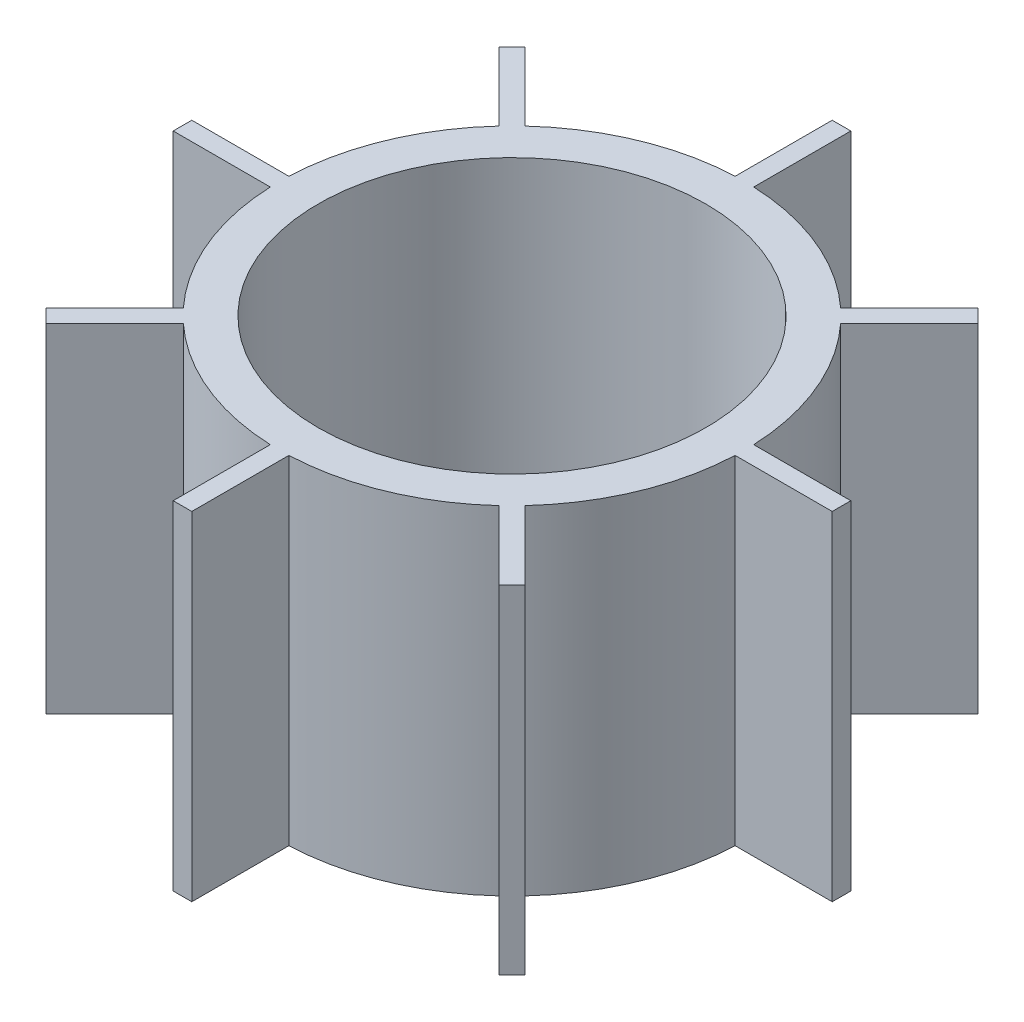
ISO-10303-21;
HEADER;
FILE_DESCRIPTION(('STEP AP214'),'2;1');
FILE_NAME('part.step','',(''),(''),'','','');
FILE_SCHEMA(('AUTOMOTIVE_DESIGN { 1 0 10303 214 1 1 1 1 }'));
ENDSEC;
DATA;
#1=APPLICATION_CONTEXT('core data for automotive mechanical design processes');
#2=APPLICATION_PROTOCOL_DEFINITION('international standard','automotive_design',2000,#1);
#3=PRODUCT_CONTEXT('',#1,'mechanical');
#4=PRODUCT('Part','Part','',(#3));
#5=PRODUCT_RELATED_PRODUCT_CATEGORY('part','',(#4));
#6=PRODUCT_DEFINITION_FORMATION('','',#4);
#7=PRODUCT_DEFINITION_CONTEXT('part definition',#1,'design');
#8=PRODUCT_DEFINITION('design','',#6,#7);
#9=PRODUCT_DEFINITION_SHAPE('','',#8);
#10=(LENGTH_UNIT() NAMED_UNIT(*) SI_UNIT(.MILLI.,.METRE.));
#11=(NAMED_UNIT(*) PLANE_ANGLE_UNIT() SI_UNIT($,.RADIAN.));
#12=(NAMED_UNIT(*) SI_UNIT($,.STERADIAN.) SOLID_ANGLE_UNIT());
#13=UNCERTAINTY_MEASURE_WITH_UNIT(LENGTH_MEASURE(1.E-05),#10,'distance_accuracy_value','');
#14=(GEOMETRIC_REPRESENTATION_CONTEXT(3) GLOBAL_UNCERTAINTY_ASSIGNED_CONTEXT((#13)) GLOBAL_UNIT_ASSIGNED_CONTEXT((#10,
#11,#12)) REPRESENTATION_CONTEXT('',''));
#15=CARTESIAN_POINT('',(0.,0.,0.));
#16=DIRECTION('',(0.,0.,1.));
#17=DIRECTION('',(1.,0.,0.));
#18=AXIS2_PLACEMENT_3D('',#15,#16,#17);
#19=CARTESIAN_POINT('',(0.,55.372,0.));
#20=DIRECTION('',(0.,-1.,0.));
#21=DIRECTION('',(0.,0.,-1.));
#22=AXIS2_PLACEMENT_3D('',#19,#20,#21);
#23=CYLINDRICAL_SURFACE('',#22,38.1);
#24=CARTESIAN_POINT('',(0.,55.372,0.));
#25=DIRECTION('',(0.,1.,0.));
#26=DIRECTION('',(0.,0.,1.));
#27=AXIS2_PLACEMENT_3D('',#24,#25,#26);
#28=CIRCLE('',#27,38.1);
#29=CARTESIAN_POINT('',(-25.8415763860386,55.372,27.9968378550959));
#30=VERTEX_POINT('',#29);
#31=CARTESIAN_POINT('',(-1.524,55.372,38.0695077982366));
#32=VERTEX_POINT('',#31);
#33=EDGE_CURVE('E287',#30,#32,#28,.T.);
#34=ORIENTED_EDGE('',*,*,#33,.F.);
#35=DIRECTION('',(0.,-1.,0.));
#36=VECTOR('',#35,1.);
#37=CARTESIAN_POINT('',(-25.8415763860386,55.372,27.9968378550959));
#38=LINE('',#37,#36);
#39=CARTESIAN_POINT('',(-25.8415763860386,0.,27.9968378550959));
#40=VERTEX_POINT('',#39);
#41=EDGE_CURVE('E464',#40,#30,#38,.F.);
#42=ORIENTED_EDGE('',*,*,#41,.F.);
#43=CARTESIAN_POINT('',(0.,0.,0.));
#44=DIRECTION('',(0.,1.,0.));
#45=DIRECTION('',(0.,0.,1.));
#46=AXIS2_PLACEMENT_3D('',#43,#44,#45);
#47=CIRCLE('',#46,38.1);
#48=CARTESIAN_POINT('',(-1.524,0.,38.0695077982366));
#49=VERTEX_POINT('',#48);
#50=EDGE_CURVE('E255',#40,#49,#47,.T.);
#51=ORIENTED_EDGE('',*,*,#50,.T.);
#52=DIRECTION('',(0.,-1.,0.));
#53=VECTOR('',#52,1.);
#54=CARTESIAN_POINT('',(-1.524,55.372,38.0695077982366));
#55=LINE('',#54,#53);
#56=EDGE_CURVE('E262',#32,#49,#55,.T.);
#57=ORIENTED_EDGE('',*,*,#56,.F.);
#58=EDGE_LOOP('',(#34,#42,#51,#57));
#59=FACE_BOUND('',#58,.T.);
#60=ADVANCED_FACE('F30',(#59),#23,.T.);
#61=CARTESIAN_POINT('',(-37.0884577800151,0.,39.2437192490727));
#62=DIRECTION('',(-0.707106781186539,0.,0.707106781186556));
#63=DIRECTION('',(0.707106781186556,0.,0.707106781186539));
#64=AXIS2_PLACEMENT_3D('',#61,#62,#63);
#65=PLANE('',#64);
#66=DIRECTION('',(0.,1.,0.));
#67=VECTOR('',#66,1.);
#68=CARTESIAN_POINT('',(-37.0884577800151,55.372,39.2437192490727));
#69=LINE('',#68,#67);
#70=CARTESIAN_POINT('',(-37.0884577800151,0.,39.2437192490727));
#71=VERTEX_POINT('',#70);
#72=CARTESIAN_POINT('',(-37.0884577800151,55.372,39.2437192490727));
#73=VERTEX_POINT('',#72);
#74=EDGE_CURVE('E467',#71,#73,#69,.T.);
#75=ORIENTED_EDGE('',*,*,#74,.T.);
#76=DIRECTION('',(-0.707106781186556,0.,-0.707106781186539));
#77=VECTOR('',#76,1.);
#78=CARTESIAN_POINT('',(-39.2437192490717,55.372,37.0884577800161));
#79=LINE('',#78,#77);
#80=CARTESIAN_POINT('',(-39.2437192490717,55.372,37.0884577800161));
#81=VERTEX_POINT('',#80);
#82=EDGE_CURVE('E38',#73,#81,#79,.T.);
#83=ORIENTED_EDGE('',*,*,#82,.T.);
#84=DIRECTION('',(0.,-1.,0.));
#85=VECTOR('',#84,1.);
#86=CARTESIAN_POINT('',(-39.2437192490717,55.372,37.0884577800161));
#87=LINE('',#86,#85);
#88=CARTESIAN_POINT('',(-39.2437192490717,0.,37.0884577800161));
#89=VERTEX_POINT('',#88);
#90=EDGE_CURVE('E460',#81,#89,#87,.T.);
#91=ORIENTED_EDGE('',*,*,#90,.T.);
#92=DIRECTION('',(0.707106781186556,0.,0.707106781186539));
#93=VECTOR('',#92,1.);
#94=CARTESIAN_POINT('',(-39.2437192490717,0.,37.0884577800161));
#95=LINE('',#94,#93);
#96=EDGE_CURVE('E11',#89,#71,#95,.T.);
#97=ORIENTED_EDGE('',*,*,#96,.T.);
#98=EDGE_LOOP('',(#75,#83,#91,#97));
#99=FACE_BOUND('',#98,.T.);
#100=ADVANCED_FACE('F32',(#99),#65,.T.);
#101=CARTESIAN_POINT('',(353554.468224004,55.372,-353552.312962544));
#102=DIRECTION('',(0.707106781186556,0.,0.707106781186539));
#103=DIRECTION('',(0.707106781186539,0.,-0.707106781186556));
#104=AXIS2_PLACEMENT_3D('',#101,#102,#103);
#105=PLANE('',#104);
#106=DIRECTION('',(-0.707106781186539,0.,0.707106781186556));
#107=VECTOR('',#106,1.);
#108=CARTESIAN_POINT('',(353554.468224004,0.,-353552.312962544));
#109=LINE('',#108,#107);
#110=EDGE_CURVE('E45',#40,#71,#109,.T.);
#111=ORIENTED_EDGE('',*,*,#110,.F.);
#112=ORIENTED_EDGE('',*,*,#41,.T.);
#113=DIRECTION('',(-0.707106781186539,0.,0.707106781186556));
#114=VECTOR('',#113,1.);
#115=CARTESIAN_POINT('',(353554.468224004,55.372,-353552.312962544));
#116=LINE('',#115,#114);
#117=EDGE_CURVE('E52',#30,#73,#116,.T.);
#118=ORIENTED_EDGE('',*,*,#117,.T.);
#119=ORIENTED_EDGE('',*,*,#74,.F.);
#120=EDGE_LOOP('',(#111,#112,#118,#119));
#121=FACE_BOUND('',#120,.T.);
#122=ADVANCED_FACE('F615',(#121),#105,.T.);
#123=CARTESIAN_POINT('',(353552.312962535,55.372,-353554.468224013));
#124=DIRECTION('',(-0.707106781186556,0.,-0.707106781186539));
#125=DIRECTION('',(-0.707106781186539,0.,0.707106781186556));
#126=AXIS2_PLACEMENT_3D('',#123,#124,#125);
#127=PLANE('',#126);
#128=DIRECTION('',(-0.707106781186539,0.,0.707106781186556));
#129=VECTOR('',#128,1.);
#130=CARTESIAN_POINT('',(353552.312962535,55.372,-353554.468224013));
#131=LINE('',#130,#129);
#132=CARTESIAN_POINT('',(-27.9968378550953,55.372,25.8415763860393));
#133=VERTEX_POINT('',#132);
#134=EDGE_CURVE('E453',#133,#81,#131,.T.);
#135=ORIENTED_EDGE('',*,*,#134,.F.);
#136=DIRECTION('',(0.,-1.,0.));
#137=VECTOR('',#136,1.);
#138=CARTESIAN_POINT('',(-27.9968378550953,55.372,25.8415763860393));
#139=LINE('',#138,#137);
#140=CARTESIAN_POINT('',(-27.9968378550953,0.,25.8415763860393));
#141=VERTEX_POINT('',#140);
#142=EDGE_CURVE('E455',#133,#141,#139,.T.);
#143=ORIENTED_EDGE('',*,*,#142,.T.);
#144=DIRECTION('',(-0.707106781186539,0.,0.707106781186556));
#145=VECTOR('',#144,1.);
#146=CARTESIAN_POINT('',(353552.312962535,0.,-353554.468224013));
#147=LINE('',#146,#145);
#148=EDGE_CURVE('E458',#141,#89,#147,.T.);
#149=ORIENTED_EDGE('',*,*,#148,.T.);
#150=ORIENTED_EDGE('',*,*,#90,.F.);
#151=EDGE_LOOP('',(#135,#143,#149,#150));
#152=FACE_BOUND('',#151,.T.);
#153=ADVANCED_FACE('F479',(#152),#127,.T.);
#154=CARTESIAN_POINT('',(-38.0695077982366,55.372,1.5240000000004));
#155=VERTEX_POINT('',#154);
#156=EDGE_CURVE('E425',#155,#133,#28,.T.);
#157=ORIENTED_EDGE('',*,*,#156,.F.);
#158=DIRECTION('',(0.,-1.,0.));
#159=VECTOR('',#158,1.);
#160=CARTESIAN_POINT('',(-38.0695077982366,55.372,1.5240000000004));
#161=LINE('',#160,#159);
#162=CARTESIAN_POINT('',(-38.0695077982366,0.,1.5240000000004));
#163=VERTEX_POINT('',#162);
#164=EDGE_CURVE('E439',#163,#155,#161,.F.);
#165=ORIENTED_EDGE('',*,*,#164,.F.);
#166=EDGE_CURVE('E429',#163,#141,#47,.T.);
#167=ORIENTED_EDGE('',*,*,#166,.T.);
#168=ORIENTED_EDGE('',*,*,#142,.F.);
#169=EDGE_LOOP('',(#157,#165,#167,#168));
#170=FACE_BOUND('',#169,.T.);
#171=ADVANCED_FACE('F488',(#170),#23,.T.);
#172=CARTESIAN_POINT('',(-53.975,0.,1.52400000000057));
#173=DIRECTION('',(-1.,0.,0.));
#174=DIRECTION('',(0.,0.,1.));
#175=AXIS2_PLACEMENT_3D('',#172,#173,#174);
#176=PLANE('',#175);
#177=DIRECTION('',(0.,1.,0.));
#178=VECTOR('',#177,1.);
#179=CARTESIAN_POINT('',(-53.975,55.372,1.52400000000057));
#180=LINE('',#179,#178);
#181=CARTESIAN_POINT('',(-53.975,0.,1.52400000000057));
#182=VERTEX_POINT('',#181);
#183=CARTESIAN_POINT('',(-53.975,55.372,1.52400000000057));
#184=VERTEX_POINT('',#183);
#185=EDGE_CURVE('E444',#182,#184,#180,.T.);
#186=ORIENTED_EDGE('',*,*,#185,.T.);
#187=DIRECTION('',(0.,0.,-1.));
#188=VECTOR('',#187,1.);
#189=CARTESIAN_POINT('',(-53.975,55.372,-1.52399999999943));
#190=LINE('',#189,#188);
#191=CARTESIAN_POINT('',(-53.975,55.372,-1.52399999999943));
#192=VERTEX_POINT('',#191);
#193=EDGE_CURVE('E447',#184,#192,#190,.T.);
#194=ORIENTED_EDGE('',*,*,#193,.T.);
#195=DIRECTION('',(0.,-1.,0.));
#196=VECTOR('',#195,1.);
#197=CARTESIAN_POINT('',(-53.975,55.372,-1.52399999999943));
#198=LINE('',#197,#196);
#199=CARTESIAN_POINT('',(-53.975,0.,-1.52399999999943));
#200=VERTEX_POINT('',#199);
#201=EDGE_CURVE('E434',#192,#200,#198,.T.);
#202=ORIENTED_EDGE('',*,*,#201,.T.);
#203=DIRECTION('',(0.,0.,1.));
#204=VECTOR('',#203,1.);
#205=CARTESIAN_POINT('',(-53.975,0.,-1.52399999999943));
#206=LINE('',#205,#204);
#207=EDGE_CURVE('E450',#200,#182,#206,.T.);
#208=ORIENTED_EDGE('',*,*,#207,.T.);
#209=EDGE_LOOP('',(#186,#194,#202,#208));
#210=FACE_BOUND('',#209,.T.);
#211=ADVANCED_FACE('F543',(#210),#176,.T.);
#212=CARTESIAN_POINT('',(500000.,55.372,1.52399999476278));
#213=DIRECTION('',(0.,0.,1.));
#214=DIRECTION('',(1.,0.,0.));
#215=AXIS2_PLACEMENT_3D('',#212,#213,#214);
#216=PLANE('',#215);
#217=DIRECTION('',(-1.,0.,0.));
#218=VECTOR('',#217,1.);
#219=CARTESIAN_POINT('',(500000.,0.,1.52399999476278));
#220=LINE('',#219,#218);
#221=EDGE_CURVE('E437',#163,#182,#220,.T.);
#222=ORIENTED_EDGE('',*,*,#221,.F.);
#223=ORIENTED_EDGE('',*,*,#164,.T.);
#224=DIRECTION('',(-1.,0.,0.));
#225=VECTOR('',#224,1.);
#226=CARTESIAN_POINT('',(500000.,55.372,1.52399999476278));
#227=LINE('',#226,#225);
#228=EDGE_CURVE('E442',#155,#184,#227,.T.);
#229=ORIENTED_EDGE('',*,*,#228,.T.);
#230=ORIENTED_EDGE('',*,*,#185,.F.);
#231=EDGE_LOOP('',(#222,#223,#229,#230));
#232=FACE_BOUND('',#231,.T.);
#233=ADVANCED_FACE('F487',(#232),#216,.T.);
#234=CARTESIAN_POINT('',(500000.,55.372,-1.52400000523722));
#235=DIRECTION('',(0.,0.,-1.));
#236=DIRECTION('',(-1.,0.,0.));
#237=AXIS2_PLACEMENT_3D('',#234,#235,#236);
#238=PLANE('',#237);
#239=DIRECTION('',(-1.,0.,0.));
#240=VECTOR('',#239,1.);
#241=CARTESIAN_POINT('',(500000.,55.372,-1.52400000523722));
#242=LINE('',#241,#240);
#243=CARTESIAN_POINT('',(-38.0695077982366,55.372,-1.5239999999996));
#244=VERTEX_POINT('',#243);
#245=EDGE_CURVE('E426',#244,#192,#242,.T.);
#246=ORIENTED_EDGE('',*,*,#245,.F.);
#247=DIRECTION('',(0.,-1.,0.));
#248=VECTOR('',#247,1.);
#249=CARTESIAN_POINT('',(-38.0695077982366,55.372,-1.5239999999996));
#250=LINE('',#249,#248);
#251=CARTESIAN_POINT('',(-38.0695077982366,0.,-1.5239999999996));
#252=VERTEX_POINT('',#251);
#253=EDGE_CURVE('E428',#244,#252,#250,.T.);
#254=ORIENTED_EDGE('',*,*,#253,.T.);
#255=DIRECTION('',(-1.,0.,0.));
#256=VECTOR('',#255,1.);
#257=CARTESIAN_POINT('',(500000.,0.,-1.52400000523722));
#258=LINE('',#257,#256);
#259=EDGE_CURVE('E432',#252,#200,#258,.T.);
#260=ORIENTED_EDGE('',*,*,#259,.T.);
#261=ORIENTED_EDGE('',*,*,#201,.F.);
#262=EDGE_LOOP('',(#246,#254,#260,#261));
#263=FACE_BOUND('',#262,.T.);
#264=ADVANCED_FACE('F540',(#263),#238,.T.);
#265=CARTESIAN_POINT('',(-27.9968378550958,55.372,-25.8415763860387));
#266=VERTEX_POINT('',#265);
#267=EDGE_CURVE('E397',#266,#244,#28,.T.);
#268=ORIENTED_EDGE('',*,*,#267,.F.);
#269=DIRECTION('',(0.,-1.,0.));
#270=VECTOR('',#269,1.);
#271=CARTESIAN_POINT('',(-27.9968378550958,55.372,-25.8415763860387));
#272=LINE('',#271,#270);
#273=CARTESIAN_POINT('',(-27.9968378550958,0.,-25.8415763860387));
#274=VERTEX_POINT('',#273);
#275=EDGE_CURVE('E411',#274,#266,#272,.F.);
#276=ORIENTED_EDGE('',*,*,#275,.F.);
#277=EDGE_CURVE('E401',#274,#252,#47,.T.);
#278=ORIENTED_EDGE('',*,*,#277,.T.);
#279=ORIENTED_EDGE('',*,*,#253,.F.);
#280=EDGE_LOOP('',(#268,#276,#278,#279));
#281=FACE_BOUND('',#280,.T.);
#282=ADVANCED_FACE('F535',(#281),#23,.T.);
#283=CARTESIAN_POINT('',(-39.2437192490725,0.,-37.0884577800153));
#284=DIRECTION('',(-0.707106781186554,0.,-0.707106781186541));
#285=DIRECTION('',(-0.707106781186541,0.,0.707106781186554));
#286=AXIS2_PLACEMENT_3D('',#283,#284,#285);
#287=PLANE('',#286);
#288=DIRECTION('',(0.,1.,0.));
#289=VECTOR('',#288,1.);
#290=CARTESIAN_POINT('',(-39.2437192490725,55.372,-37.0884577800153));
#291=LINE('',#290,#289);
#292=CARTESIAN_POINT('',(-39.2437192490725,0.,-37.0884577800153));
#293=VERTEX_POINT('',#292);
#294=CARTESIAN_POINT('',(-39.2437192490725,55.372,-37.0884577800153));
#295=VERTEX_POINT('',#294);
#296=EDGE_CURVE('E416',#293,#295,#291,.T.);
#297=ORIENTED_EDGE('',*,*,#296,.T.);
#298=DIRECTION('',(0.707106781186541,0.,-0.707106781186554));
#299=VECTOR('',#298,1.);
#300=CARTESIAN_POINT('',(-37.0884577800159,55.372,-39.2437192490719));
#301=LINE('',#300,#299);
#302=CARTESIAN_POINT('',(-37.0884577800159,55.372,-39.2437192490719));
#303=VERTEX_POINT('',#302);
#304=EDGE_CURVE('E419',#295,#303,#301,.T.);
#305=ORIENTED_EDGE('',*,*,#304,.T.);
#306=DIRECTION('',(0.,-1.,0.));
#307=VECTOR('',#306,1.);
#308=CARTESIAN_POINT('',(-37.0884577800159,55.372,-39.2437192490719));
#309=LINE('',#308,#307);
#310=CARTESIAN_POINT('',(-37.0884577800159,0.,-39.2437192490719));
#311=VERTEX_POINT('',#310);
#312=EDGE_CURVE('E406',#303,#311,#309,.T.);
#313=ORIENTED_EDGE('',*,*,#312,.T.);
#314=DIRECTION('',(-0.707106781186541,0.,0.707106781186554));
#315=VECTOR('',#314,1.);
#316=CARTESIAN_POINT('',(-37.0884577800159,0.,-39.2437192490719));
#317=LINE('',#316,#315);
#318=EDGE_CURVE('E422',#311,#293,#317,.T.);
#319=ORIENTED_EDGE('',*,*,#318,.T.);
#320=EDGE_LOOP('',(#297,#305,#313,#319));
#321=FACE_BOUND('',#320,.T.);
#322=ADVANCED_FACE('F553',(#321),#287,.T.);
#323=CARTESIAN_POINT('',(353552.312962542,55.372,353554.468224005));
#324=DIRECTION('',(-0.707106781186541,0.,0.707106781186554));
#325=DIRECTION('',(0.707106781186554,0.,0.707106781186541));
#326=AXIS2_PLACEMENT_3D('',#323,#324,#325);
#327=PLANE('',#326);
#328=DIRECTION('',(-0.707106781186554,0.,-0.707106781186541));
#329=VECTOR('',#328,1.);
#330=CARTESIAN_POINT('',(353552.312962542,0.,353554.468224005));
#331=LINE('',#330,#329);
#332=EDGE_CURVE('E409',#274,#293,#331,.T.);
#333=ORIENTED_EDGE('',*,*,#332,.F.);
#334=ORIENTED_EDGE('',*,*,#275,.T.);
#335=DIRECTION('',(-0.707106781186554,0.,-0.707106781186541));
#336=VECTOR('',#335,1.);
#337=CARTESIAN_POINT('',(353552.312962542,55.372,353554.468224005));
#338=LINE('',#337,#336);
#339=EDGE_CURVE('E414',#266,#295,#338,.T.);
#340=ORIENTED_EDGE('',*,*,#339,.T.);
#341=ORIENTED_EDGE('',*,*,#296,.F.);
#342=EDGE_LOOP('',(#333,#334,#340,#341));
#343=FACE_BOUND('',#342,.T.);
#344=ADVANCED_FACE('F548',(#343),#327,.T.);
#345=CARTESIAN_POINT('',(353554.468224011,55.372,353552.312962536));
#346=DIRECTION('',(0.707106781186541,0.,-0.707106781186554));
#347=DIRECTION('',(-0.707106781186554,0.,-0.707106781186541));
#348=AXIS2_PLACEMENT_3D('',#345,#346,#347);
#349=PLANE('',#348);
#350=DIRECTION('',(-0.707106781186554,0.,-0.707106781186541));
#351=VECTOR('',#350,1.);
#352=CARTESIAN_POINT('',(353554.468224011,55.372,353552.312962536));
#353=LINE('',#352,#351);
#354=CARTESIAN_POINT('',(-25.8415763860392,55.372,-27.9968378550954));
#355=VERTEX_POINT('',#354);
#356=EDGE_CURVE('E398',#355,#303,#353,.T.);
#357=ORIENTED_EDGE('',*,*,#356,.F.);
#358=DIRECTION('',(0.,-1.,0.));
#359=VECTOR('',#358,1.);
#360=CARTESIAN_POINT('',(-25.8415763860392,55.372,-27.9968378550954));
#361=LINE('',#360,#359);
#362=CARTESIAN_POINT('',(-25.8415763860392,0.,-27.9968378550954));
#363=VERTEX_POINT('',#362);
#364=EDGE_CURVE('E400',#355,#363,#361,.T.);
#365=ORIENTED_EDGE('',*,*,#364,.T.);
#366=DIRECTION('',(-0.707106781186554,0.,-0.707106781186541));
#367=VECTOR('',#366,1.);
#368=CARTESIAN_POINT('',(353554.468224011,0.,353552.312962536));
#369=LINE('',#368,#367);
#370=EDGE_CURVE('E404',#363,#311,#369,.T.);
#371=ORIENTED_EDGE('',*,*,#370,.T.);
#372=ORIENTED_EDGE('',*,*,#312,.F.);
#373=EDGE_LOOP('',(#357,#365,#371,#372));
#374=FACE_BOUND('',#373,.T.);
#375=ADVANCED_FACE('F556',(#374),#349,.T.);
#376=CARTESIAN_POINT('',(-1.524,55.372,-38.0695077982366));
#377=VERTEX_POINT('',#376);
#378=EDGE_CURVE('E369',#377,#355,#28,.T.);
#379=ORIENTED_EDGE('',*,*,#378,.F.);
#380=DIRECTION('',(0.,-1.,0.));
#381=VECTOR('',#380,1.);
#382=CARTESIAN_POINT('',(-1.524,55.372,-38.0695077982366));
#383=LINE('',#382,#381);
#384=CARTESIAN_POINT('',(-1.524,0.,-38.0695077982366));
#385=VERTEX_POINT('',#384);
#386=EDGE_CURVE('E383',#385,#377,#383,.F.);
#387=ORIENTED_EDGE('',*,*,#386,.F.);
#388=EDGE_CURVE('E373',#385,#363,#47,.T.);
#389=ORIENTED_EDGE('',*,*,#388,.T.);
#390=ORIENTED_EDGE('',*,*,#364,.F.);
#391=EDGE_LOOP('',(#379,#387,#389,#390));
#392=FACE_BOUND('',#391,.T.);
#393=ADVANCED_FACE('F557',(#392),#23,.T.);
#394=CARTESIAN_POINT('',(-1.524,0.,-53.975));
#395=DIRECTION('',(0.,0.,-1.));
#396=DIRECTION('',(-1.,0.,0.));
#397=AXIS2_PLACEMENT_3D('',#394,#395,#396);
#398=PLANE('',#397);
#399=DIRECTION('',(0.,1.,0.));
#400=VECTOR('',#399,1.);
#401=CARTESIAN_POINT('',(-1.524,55.372,-53.975));
#402=LINE('',#401,#400);
#403=CARTESIAN_POINT('',(-1.524,0.,-53.975));
#404=VERTEX_POINT('',#403);
#405=CARTESIAN_POINT('',(-1.524,55.372,-53.975));
#406=VERTEX_POINT('',#405);
#407=EDGE_CURVE('E388',#404,#406,#402,.T.);
#408=ORIENTED_EDGE('',*,*,#407,.T.);
#409=DIRECTION('',(1.,0.,0.));
#410=VECTOR('',#409,1.);
#411=CARTESIAN_POINT('',(1.524,55.372,-53.975));
#412=LINE('',#411,#410);
#413=CARTESIAN_POINT('',(1.524,55.372,-53.975));
#414=VERTEX_POINT('',#413);
#415=EDGE_CURVE('E391',#406,#414,#412,.T.);
#416=ORIENTED_EDGE('',*,*,#415,.T.);
#417=DIRECTION('',(0.,-1.,0.));
#418=VECTOR('',#417,1.);
#419=CARTESIAN_POINT('',(1.524,55.372,-53.975));
#420=LINE('',#419,#418);
#421=CARTESIAN_POINT('',(1.524,0.,-53.975));
#422=VERTEX_POINT('',#421);
#423=EDGE_CURVE('E378',#414,#422,#420,.T.);
#424=ORIENTED_EDGE('',*,*,#423,.T.);
#425=DIRECTION('',(-1.,0.,0.));
#426=VECTOR('',#425,1.);
#427=CARTESIAN_POINT('',(1.524,0.,-53.975));
#428=LINE('',#427,#426);
#429=EDGE_CURVE('E394',#422,#404,#428,.T.);
#430=ORIENTED_EDGE('',*,*,#429,.T.);
#431=EDGE_LOOP('',(#408,#416,#424,#430));
#432=FACE_BOUND('',#431,.T.);
#433=ADVANCED_FACE('F565',(#432),#398,.T.);
#434=CARTESIAN_POINT('',(-1.524,55.372,500000.));
#435=DIRECTION('',(-1.,0.,0.));
#436=DIRECTION('',(0.,0.,1.));
#437=AXIS2_PLACEMENT_3D('',#434,#435,#436);
#438=PLANE('',#437);
#439=DIRECTION('',(0.,0.,-1.));
#440=VECTOR('',#439,1.);
#441=CARTESIAN_POINT('',(-1.524,0.,500000.));
#442=LINE('',#441,#440);
#443=EDGE_CURVE('E381',#385,#404,#442,.T.);
#444=ORIENTED_EDGE('',*,*,#443,.F.);
#445=ORIENTED_EDGE('',*,*,#386,.T.);
#446=DIRECTION('',(0.,0.,-1.));
#447=VECTOR('',#446,1.);
#448=CARTESIAN_POINT('',(-1.524,55.372,500000.));
#449=LINE('',#448,#447);
#450=EDGE_CURVE('E386',#377,#406,#449,.T.);
#451=ORIENTED_EDGE('',*,*,#450,.T.);
#452=ORIENTED_EDGE('',*,*,#407,.F.);
#453=EDGE_LOOP('',(#444,#445,#451,#452));
#454=FACE_BOUND('',#453,.T.);
#455=ADVANCED_FACE('F560',(#454),#438,.T.);
#456=CARTESIAN_POINT('',(1.524,55.372,500000.));
#457=DIRECTION('',(1.,0.,0.));
#458=DIRECTION('',(0.,0.,-1.));
#459=AXIS2_PLACEMENT_3D('',#456,#457,#458);
#460=PLANE('',#459);
#461=DIRECTION('',(0.,0.,-1.));
#462=VECTOR('',#461,1.);
#463=CARTESIAN_POINT('',(1.524,55.372,500000.));
#464=LINE('',#463,#462);
#465=CARTESIAN_POINT('',(1.524,55.372,-38.0695077982366));
#466=VERTEX_POINT('',#465);
#467=EDGE_CURVE('E370',#466,#414,#464,.T.);
#468=ORIENTED_EDGE('',*,*,#467,.F.);
#469=DIRECTION('',(0.,-1.,0.));
#470=VECTOR('',#469,1.);
#471=CARTESIAN_POINT('',(1.524,55.372,-38.0695077982366));
#472=LINE('',#471,#470);
#473=CARTESIAN_POINT('',(1.524,0.,-38.0695077982366));
#474=VERTEX_POINT('',#473);
#475=EDGE_CURVE('E372',#466,#474,#472,.T.);
#476=ORIENTED_EDGE('',*,*,#475,.T.);
#477=DIRECTION('',(0.,0.,-1.));
#478=VECTOR('',#477,1.);
#479=CARTESIAN_POINT('',(1.524,0.,500000.));
#480=LINE('',#479,#478);
#481=EDGE_CURVE('E376',#474,#422,#480,.T.);
#482=ORIENTED_EDGE('',*,*,#481,.T.);
#483=ORIENTED_EDGE('',*,*,#423,.F.);
#484=EDGE_LOOP('',(#468,#476,#482,#483));
#485=FACE_BOUND('',#484,.T.);
#486=ADVANCED_FACE('F570',(#485),#460,.T.);
#487=CARTESIAN_POINT('',(25.8415763860388,55.372,-27.9968378550957));
#488=VERTEX_POINT('',#487);
#489=EDGE_CURVE('E341',#488,#466,#28,.T.);
#490=ORIENTED_EDGE('',*,*,#489,.F.);
#491=DIRECTION('',(0.,-1.,0.));
#492=VECTOR('',#491,1.);
#493=CARTESIAN_POINT('',(25.8415763860388,55.372,-27.9968378550957));
#494=LINE('',#493,#492);
#495=CARTESIAN_POINT('',(25.8415763860388,0.,-27.9968378550957));
#496=VERTEX_POINT('',#495);
#497=EDGE_CURVE('E355',#496,#488,#494,.F.);
#498=ORIENTED_EDGE('',*,*,#497,.F.);
#499=EDGE_CURVE('E345',#496,#474,#47,.T.);
#500=ORIENTED_EDGE('',*,*,#499,.T.);
#501=ORIENTED_EDGE('',*,*,#475,.F.);
#502=EDGE_LOOP('',(#490,#498,#500,#501));
#503=FACE_BOUND('',#502,.T.);
#504=ADVANCED_FACE('F573',(#503),#23,.T.);
#505=CARTESIAN_POINT('',(37.0884577800154,0.,-39.2437192490724));
#506=DIRECTION('',(0.707106781186544,0.,-0.707106781186551));
#507=DIRECTION('',(-0.707106781186551,0.,-0.707106781186544));
#508=AXIS2_PLACEMENT_3D('',#505,#506,#507);
#509=PLANE('',#508);
#510=DIRECTION('',(0.,1.,0.));
#511=VECTOR('',#510,1.);
#512=CARTESIAN_POINT('',(37.0884577800154,55.372,-39.2437192490724));
#513=LINE('',#512,#511);
#514=CARTESIAN_POINT('',(37.0884577800154,0.,-39.2437192490724));
#515=VERTEX_POINT('',#514);
#516=CARTESIAN_POINT('',(37.0884577800154,55.372,-39.2437192490724));
#517=VERTEX_POINT('',#516);
#518=EDGE_CURVE('E360',#515,#517,#513,.T.);
#519=ORIENTED_EDGE('',*,*,#518,.T.);
#520=DIRECTION('',(0.707106781186551,0.,0.707106781186544));
#521=VECTOR('',#520,1.);
#522=CARTESIAN_POINT('',(39.243719249072,55.372,-37.0884577800158));
#523=LINE('',#522,#521);
#524=CARTESIAN_POINT('',(39.243719249072,55.372,-37.0884577800158));
#525=VERTEX_POINT('',#524);
#526=EDGE_CURVE('E363',#517,#525,#523,.T.);
#527=ORIENTED_EDGE('',*,*,#526,.T.);
#528=DIRECTION('',(0.,-1.,0.));
#529=VECTOR('',#528,1.);
#530=CARTESIAN_POINT('',(39.243719249072,55.372,-37.0884577800158));
#531=LINE('',#530,#529);
#532=CARTESIAN_POINT('',(39.243719249072,0.,-37.0884577800158));
#533=VERTEX_POINT('',#532);
#534=EDGE_CURVE('E350',#525,#533,#531,.T.);
#535=ORIENTED_EDGE('',*,*,#534,.T.);
#536=DIRECTION('',(-0.707106781186551,0.,-0.707106781186544));
#537=VECTOR('',#536,1.);
#538=CARTESIAN_POINT('',(39.243719249072,0.,-37.0884577800158));
#539=LINE('',#538,#537);
#540=EDGE_CURVE('E366',#533,#515,#539,.T.);
#541=ORIENTED_EDGE('',*,*,#540,.T.);
#542=EDGE_LOOP('',(#519,#527,#535,#541));
#543=FACE_BOUND('',#542,.T.);
#544=ADVANCED_FACE('F581',(#543),#509,.T.);
#545=CARTESIAN_POINT('',(-353554.468224006,55.372,353552.312962541));
#546=DIRECTION('',(-0.707106781186551,0.,-0.707106781186544));
#547=DIRECTION('',(-0.707106781186544,0.,0.707106781186551));
#548=AXIS2_PLACEMENT_3D('',#545,#546,#547);
#549=PLANE('',#548);
#550=DIRECTION('',(0.707106781186544,0.,-0.707106781186551));
#551=VECTOR('',#550,1.);
#552=CARTESIAN_POINT('',(-353554.468224006,0.,353552.312962541));
#553=LINE('',#552,#551);
#554=EDGE_CURVE('E353',#496,#515,#553,.T.);
#555=ORIENTED_EDGE('',*,*,#554,.F.);
#556=ORIENTED_EDGE('',*,*,#497,.T.);
#557=DIRECTION('',(0.707106781186544,0.,-0.707106781186551));
#558=VECTOR('',#557,1.);
#559=CARTESIAN_POINT('',(-353554.468224006,55.372,353552.312962541));
#560=LINE('',#559,#558);
#561=EDGE_CURVE('E358',#488,#517,#560,.T.);
#562=ORIENTED_EDGE('',*,*,#561,.T.);
#563=ORIENTED_EDGE('',*,*,#518,.F.);
#564=EDGE_LOOP('',(#555,#556,#562,#563));
#565=FACE_BOUND('',#564,.T.);
#566=ADVANCED_FACE('F576',(#565),#549,.T.);
#567=CARTESIAN_POINT('',(-353552.312962537,55.372,353554.46822401));
#568=DIRECTION('',(0.707106781186551,0.,0.707106781186544));
#569=DIRECTION('',(0.707106781186544,0.,-0.707106781186551));
#570=AXIS2_PLACEMENT_3D('',#567,#568,#569);
#571=PLANE('',#570);
#572=DIRECTION('',(0.707106781186544,0.,-0.707106781186551));
#573=VECTOR('',#572,1.);
#574=CARTESIAN_POINT('',(-353552.312962537,55.372,353554.46822401));
#575=LINE('',#574,#573);
#576=CARTESIAN_POINT('',(27.9968378550954,55.372,-25.8415763860391));
#577=VERTEX_POINT('',#576);
#578=EDGE_CURVE('E342',#577,#525,#575,.T.);
#579=ORIENTED_EDGE('',*,*,#578,.F.);
#580=DIRECTION('',(0.,-1.,0.));
#581=VECTOR('',#580,1.);
#582=CARTESIAN_POINT('',(27.9968378550954,55.372,-25.8415763860391));
#583=LINE('',#582,#581);
#584=CARTESIAN_POINT('',(27.9968378550954,0.,-25.8415763860391));
#585=VERTEX_POINT('',#584);
#586=EDGE_CURVE('E344',#577,#585,#583,.T.);
#587=ORIENTED_EDGE('',*,*,#586,.T.);
#588=DIRECTION('',(0.707106781186544,0.,-0.707106781186551));
#589=VECTOR('',#588,1.);
#590=CARTESIAN_POINT('',(-353552.312962537,0.,353554.46822401));
#591=LINE('',#590,#589);
#592=EDGE_CURVE('E348',#585,#533,#591,.T.);
#593=ORIENTED_EDGE('',*,*,#592,.T.);
#594=ORIENTED_EDGE('',*,*,#534,.F.);
#595=EDGE_LOOP('',(#579,#587,#593,#594));
#596=FACE_BOUND('',#595,.T.);
#597=ADVANCED_FACE('F586',(#596),#571,.T.);
#598=CARTESIAN_POINT('',(38.0695077982366,55.372,-1.52400000000014));
#599=VERTEX_POINT('',#598);
#600=EDGE_CURVE('E313',#599,#577,#28,.T.);
#601=ORIENTED_EDGE('',*,*,#600,.F.);
#602=DIRECTION('',(0.,-1.,0.));
#603=VECTOR('',#602,1.);
#604=CARTESIAN_POINT('',(38.0695077982366,55.372,-1.52400000000014));
#605=LINE('',#604,#603);
#606=CARTESIAN_POINT('',(38.0695077982366,0.,-1.52400000000014));
#607=VERTEX_POINT('',#606);
#608=EDGE_CURVE('E327',#607,#599,#605,.F.);
#609=ORIENTED_EDGE('',*,*,#608,.F.);
#610=EDGE_CURVE('E317',#607,#585,#47,.T.);
#611=ORIENTED_EDGE('',*,*,#610,.T.);
#612=ORIENTED_EDGE('',*,*,#586,.F.);
#613=EDGE_LOOP('',(#601,#609,#611,#612));
#614=FACE_BOUND('',#613,.T.);
#615=ADVANCED_FACE('F589',(#614),#23,.T.);
#616=CARTESIAN_POINT('',(53.975,0.,-1.52400000000019));
#617=DIRECTION('',(1.,0.,0.));
#618=DIRECTION('',(0.,0.,-1.));
#619=AXIS2_PLACEMENT_3D('',#616,#617,#618);
#620=PLANE('',#619);
#621=DIRECTION('',(0.,1.,0.));
#622=VECTOR('',#621,1.);
#623=CARTESIAN_POINT('',(53.975,55.372,-1.52400000000019));
#624=LINE('',#623,#622);
#625=CARTESIAN_POINT('',(53.975,0.,-1.52400000000019));
#626=VERTEX_POINT('',#625);
#627=CARTESIAN_POINT('',(53.975,55.372,-1.52400000000019));
#628=VERTEX_POINT('',#627);
#629=EDGE_CURVE('E332',#626,#628,#624,.T.);
#630=ORIENTED_EDGE('',*,*,#629,.T.);
#631=DIRECTION('',(0.,0.,1.));
#632=VECTOR('',#631,1.);
#633=CARTESIAN_POINT('',(53.975,55.372,1.52399999999981));
#634=LINE('',#633,#632);
#635=CARTESIAN_POINT('',(53.975,55.372,1.52399999999981));
#636=VERTEX_POINT('',#635);
#637=EDGE_CURVE('E335',#628,#636,#634,.T.);
#638=ORIENTED_EDGE('',*,*,#637,.T.);
#639=DIRECTION('',(0.,-1.,0.));
#640=VECTOR('',#639,1.);
#641=CARTESIAN_POINT('',(53.975,55.372,1.52399999999981));
#642=LINE('',#641,#640);
#643=CARTESIAN_POINT('',(53.975,0.,1.52399999999981));
#644=VERTEX_POINT('',#643);
#645=EDGE_CURVE('E322',#636,#644,#642,.T.);
#646=ORIENTED_EDGE('',*,*,#645,.T.);
#647=DIRECTION('',(0.,0.,-1.));
#648=VECTOR('',#647,1.);
#649=CARTESIAN_POINT('',(53.975,0.,1.52399999999981));
#650=LINE('',#649,#648);
#651=EDGE_CURVE('E338',#644,#626,#650,.T.);
#652=ORIENTED_EDGE('',*,*,#651,.T.);
#653=EDGE_LOOP('',(#630,#638,#646,#652));
#654=FACE_BOUND('',#653,.T.);
#655=ADVANCED_FACE('F597',(#654),#620,.T.);
#656=CARTESIAN_POINT('',(-500000.,55.372,-1.52399999825426));
#657=DIRECTION('',(0.,0.,-1.));
#658=DIRECTION('',(-1.,0.,0.));
#659=AXIS2_PLACEMENT_3D('',#656,#657,#658);
#660=PLANE('',#659);
#661=DIRECTION('',(1.,0.,0.));
#662=VECTOR('',#661,1.);
#663=CARTESIAN_POINT('',(-500000.,0.,-1.52399999825426));
#664=LINE('',#663,#662);
#665=EDGE_CURVE('E325',#607,#626,#664,.T.);
#666=ORIENTED_EDGE('',*,*,#665,.F.);
#667=ORIENTED_EDGE('',*,*,#608,.T.);
#668=DIRECTION('',(1.,0.,0.));
#669=VECTOR('',#668,1.);
#670=CARTESIAN_POINT('',(-500000.,55.372,-1.52399999825426));
#671=LINE('',#670,#669);
#672=EDGE_CURVE('E330',#599,#628,#671,.T.);
#673=ORIENTED_EDGE('',*,*,#672,.T.);
#674=ORIENTED_EDGE('',*,*,#629,.F.);
#675=EDGE_LOOP('',(#666,#667,#673,#674));
#676=FACE_BOUND('',#675,.T.);
#677=ADVANCED_FACE('F592',(#676),#660,.T.);
#678=CARTESIAN_POINT('',(-500000.,55.372,1.52400000174574));
#679=DIRECTION('',(0.,0.,1.));
#680=DIRECTION('',(1.,0.,0.));
#681=AXIS2_PLACEMENT_3D('',#678,#679,#680);
#682=PLANE('',#681);
#683=DIRECTION('',(1.,0.,0.));
#684=VECTOR('',#683,1.);
#685=CARTESIAN_POINT('',(-500000.,55.372,1.52400000174574));
#686=LINE('',#685,#684);
#687=CARTESIAN_POINT('',(38.0695077982366,55.372,1.52399999999986));
#688=VERTEX_POINT('',#687);
#689=EDGE_CURVE('E314',#688,#636,#686,.T.);
#690=ORIENTED_EDGE('',*,*,#689,.F.);
#691=DIRECTION('',(0.,-1.,0.));
#692=VECTOR('',#691,1.);
#693=CARTESIAN_POINT('',(38.0695077982366,55.372,1.52399999999986));
#694=LINE('',#693,#692);
#695=CARTESIAN_POINT('',(38.0695077982366,0.,1.52399999999986));
#696=VERTEX_POINT('',#695);
#697=EDGE_CURVE('E316',#688,#696,#694,.T.);
#698=ORIENTED_EDGE('',*,*,#697,.T.);
#699=DIRECTION('',(1.,0.,0.));
#700=VECTOR('',#699,1.);
#701=CARTESIAN_POINT('',(-500000.,0.,1.52400000174574));
#702=LINE('',#701,#700);
#703=EDGE_CURVE('E320',#696,#644,#702,.T.);
#704=ORIENTED_EDGE('',*,*,#703,.T.);
#705=ORIENTED_EDGE('',*,*,#645,.F.);
#706=EDGE_LOOP('',(#690,#698,#704,#705));
#707=FACE_BOUND('',#706,.T.);
#708=ADVANCED_FACE('F601',(#707),#682,.T.);
#709=CARTESIAN_POINT('',(27.9968378550956,55.372,25.8415763860389));
#710=VERTEX_POINT('',#709);
#711=EDGE_CURVE('E286',#710,#688,#28,.T.);
#712=ORIENTED_EDGE('',*,*,#711,.F.);
#713=DIRECTION('',(0.,-1.,0.));
#714=VECTOR('',#713,1.);
#715=CARTESIAN_POINT('',(27.9968378550956,55.372,25.8415763860389));
#716=LINE('',#715,#714);
#717=CARTESIAN_POINT('',(27.9968378550956,0.,25.8415763860389));
#718=VERTEX_POINT('',#717);
#719=EDGE_CURVE('E299',#718,#710,#716,.F.);
#720=ORIENTED_EDGE('',*,*,#719,.F.);
#721=EDGE_CURVE('E256',#718,#696,#47,.T.);
#722=ORIENTED_EDGE('',*,*,#721,.T.);
#723=ORIENTED_EDGE('',*,*,#697,.F.);
#724=EDGE_LOOP('',(#712,#720,#722,#723));
#725=FACE_BOUND('',#724,.T.);
#726=ADVANCED_FACE('F521',(#725),#23,.T.);
#727=CARTESIAN_POINT('',(39.2437192490723,0.,37.0884577800155));
#728=DIRECTION('',(0.707106781186549,0.,0.707106781186546));
#729=DIRECTION('',(0.707106781186546,0.,-0.707106781186549));
#730=AXIS2_PLACEMENT_3D('',#727,#728,#729);
#731=PLANE('',#730);
#732=DIRECTION('',(0.,1.,0.));
#733=VECTOR('',#732,1.);
#734=CARTESIAN_POINT('',(39.2437192490723,55.372,37.0884577800155));
#735=LINE('',#734,#733);
#736=CARTESIAN_POINT('',(39.2437192490723,0.,37.0884577800155));
#737=VERTEX_POINT('',#736);
#738=CARTESIAN_POINT('',(39.2437192490723,55.372,37.0884577800155));
#739=VERTEX_POINT('',#738);
#740=EDGE_CURVE('E304',#737,#739,#735,.T.);
#741=ORIENTED_EDGE('',*,*,#740,.T.);
#742=DIRECTION('',(-0.707106781186546,0.,0.707106781186549));
#743=VECTOR('',#742,1.);
#744=CARTESIAN_POINT('',(37.0884577800157,55.372,39.2437192490721));
#745=LINE('',#744,#743);
#746=CARTESIAN_POINT('',(37.0884577800157,55.372,39.2437192490721));
#747=VERTEX_POINT('',#746);
#748=EDGE_CURVE('E307',#739,#747,#745,.T.);
#749=ORIENTED_EDGE('',*,*,#748,.T.);
#750=DIRECTION('',(0.,-1.,0.));
#751=VECTOR('',#750,1.);
#752=CARTESIAN_POINT('',(37.0884577800157,55.372,39.2437192490721));
#753=LINE('',#752,#751);
#754=CARTESIAN_POINT('',(37.0884577800157,0.,39.2437192490721));
#755=VERTEX_POINT('',#754);
#756=EDGE_CURVE('E294',#747,#755,#753,.T.);
#757=ORIENTED_EDGE('',*,*,#756,.T.);
#758=DIRECTION('',(0.707106781186546,0.,-0.707106781186549));
#759=VECTOR('',#758,1.);
#760=CARTESIAN_POINT('',(37.0884577800157,0.,39.2437192490721));
#761=LINE('',#760,#759);
#762=EDGE_CURVE('E310',#755,#737,#761,.T.);
#763=ORIENTED_EDGE('',*,*,#762,.T.);
#764=EDGE_LOOP('',(#741,#749,#757,#763));
#765=FACE_BOUND('',#764,.T.);
#766=ADVANCED_FACE('F512',(#765),#731,.T.);
#767=CARTESIAN_POINT('',(-353552.31296254,55.372,-353554.468224008));
#768=DIRECTION('',(0.707106781186546,0.,-0.707106781186549));
#769=DIRECTION('',(-0.707106781186549,0.,-0.707106781186546));
#770=AXIS2_PLACEMENT_3D('',#767,#768,#769);
#771=PLANE('',#770);
#772=DIRECTION('',(0.707106781186549,0.,0.707106781186546));
#773=VECTOR('',#772,1.);
#774=CARTESIAN_POINT('',(-353552.31296254,0.,-353554.468224008));
#775=LINE('',#774,#773);
#776=EDGE_CURVE('E297',#718,#737,#775,.T.);
#777=ORIENTED_EDGE('',*,*,#776,.F.);
#778=ORIENTED_EDGE('',*,*,#719,.T.);
#779=DIRECTION('',(0.707106781186549,0.,0.707106781186546));
#780=VECTOR('',#779,1.);
#781=CARTESIAN_POINT('',(-353552.31296254,55.372,-353554.468224008));
#782=LINE('',#781,#780);
#783=EDGE_CURVE('E302',#710,#739,#782,.T.);
#784=ORIENTED_EDGE('',*,*,#783,.T.);
#785=ORIENTED_EDGE('',*,*,#740,.F.);
#786=EDGE_LOOP('',(#777,#778,#784,#785));
#787=FACE_BOUND('',#786,.T.);
#788=ADVANCED_FACE('F518',(#787),#771,.T.);
#789=CARTESIAN_POINT('',(-353554.468224009,55.372,-353552.312962539));
#790=DIRECTION('',(-0.707106781186546,0.,0.707106781186549));
#791=DIRECTION('',(0.707106781186549,0.,0.707106781186546));
#792=AXIS2_PLACEMENT_3D('',#789,#790,#791);
#793=PLANE('',#792);
#794=DIRECTION('',(0.707106781186549,0.,0.707106781186546));
#795=VECTOR('',#794,1.);
#796=CARTESIAN_POINT('',(-353554.468224009,55.372,-353552.312962539));
#797=LINE('',#796,#795);
#798=CARTESIAN_POINT('',(25.841576386039,55.372,27.9968378550955));
#799=VERTEX_POINT('',#798);
#800=EDGE_CURVE('E289',#799,#747,#797,.T.);
#801=ORIENTED_EDGE('',*,*,#800,.F.);
#802=DIRECTION('',(0.,-1.,0.));
#803=VECTOR('',#802,1.);
#804=CARTESIAN_POINT('',(25.841576386039,55.372,27.9968378550955));
#805=LINE('',#804,#803);
#806=CARTESIAN_POINT('',(25.841576386039,0.,27.9968378550955));
#807=VERTEX_POINT('',#806);
#808=EDGE_CURVE('E291',#799,#807,#805,.T.);
#809=ORIENTED_EDGE('',*,*,#808,.T.);
#810=DIRECTION('',(0.707106781186549,0.,0.707106781186546));
#811=VECTOR('',#810,1.);
#812=CARTESIAN_POINT('',(-353554.468224009,0.,-353552.312962539));
#813=LINE('',#812,#811);
#814=EDGE_CURVE('E248',#807,#755,#813,.T.);
#815=ORIENTED_EDGE('',*,*,#814,.T.);
#816=ORIENTED_EDGE('',*,*,#756,.F.);
#817=EDGE_LOOP('',(#801,#809,#815,#816));
#818=FACE_BOUND('',#817,.T.);
#819=ADVANCED_FACE('F510',(#818),#793,.T.);
#820=CARTESIAN_POINT('',(0.,55.372,0.));
#821=DIRECTION('',(0.,1.,0.));
#822=DIRECTION('',(0.,0.,1.));
#823=AXIS2_PLACEMENT_3D('',#820,#821,#822);
#824=PLANE('',#823);
#825=ORIENTED_EDGE('',*,*,#156,.T.);
#826=ORIENTED_EDGE('',*,*,#134,.T.);
#827=ORIENTED_EDGE('',*,*,#82,.F.);
#828=ORIENTED_EDGE('',*,*,#117,.F.);
#829=ORIENTED_EDGE('',*,*,#33,.T.);
#830=DIRECTION('',(0.,0.,1.));
#831=VECTOR('',#830,1.);
#832=CARTESIAN_POINT('',(-1.524,55.372,-500000.));
#833=LINE('',#832,#831);
#834=CARTESIAN_POINT('',(-1.524,55.372,53.975));
#835=VERTEX_POINT('',#834);
#836=EDGE_CURVE('E274',#32,#835,#833,.T.);
#837=ORIENTED_EDGE('',*,*,#836,.T.);
#838=DIRECTION('',(-1.,0.,0.));
#839=VECTOR('',#838,1.);
#840=CARTESIAN_POINT('',(-1.524,55.372,53.975));
#841=LINE('',#840,#839);
#842=CARTESIAN_POINT('',(1.524,55.372,53.975));
#843=VERTEX_POINT('',#842);
#844=EDGE_CURVE('E268',#843,#835,#841,.T.);
#845=ORIENTED_EDGE('',*,*,#844,.F.);
#846=DIRECTION('',(0.,0.,1.));
#847=VECTOR('',#846,1.);
#848=CARTESIAN_POINT('',(1.524,55.372,-500000.));
#849=LINE('',#848,#847);
#850=CARTESIAN_POINT('',(1.524,55.372,38.0695077982366));
#851=VERTEX_POINT('',#850);
#852=EDGE_CURVE('E279',#851,#843,#849,.T.);
#853=ORIENTED_EDGE('',*,*,#852,.F.);
#854=EDGE_CURVE('E252',#851,#799,#28,.T.);
#855=ORIENTED_EDGE('',*,*,#854,.T.);
#856=ORIENTED_EDGE('',*,*,#800,.T.);
#857=ORIENTED_EDGE('',*,*,#748,.F.);
#858=ORIENTED_EDGE('',*,*,#783,.F.);
#859=ORIENTED_EDGE('',*,*,#711,.T.);
#860=ORIENTED_EDGE('',*,*,#689,.T.);
#861=ORIENTED_EDGE('',*,*,#637,.F.);
#862=ORIENTED_EDGE('',*,*,#672,.F.);
#863=ORIENTED_EDGE('',*,*,#600,.T.);
#864=ORIENTED_EDGE('',*,*,#578,.T.);
#865=ORIENTED_EDGE('',*,*,#526,.F.);
#866=ORIENTED_EDGE('',*,*,#561,.F.);
#867=ORIENTED_EDGE('',*,*,#489,.T.);
#868=ORIENTED_EDGE('',*,*,#467,.T.);
#869=ORIENTED_EDGE('',*,*,#415,.F.);
#870=ORIENTED_EDGE('',*,*,#450,.F.);
#871=ORIENTED_EDGE('',*,*,#378,.T.);
#872=ORIENTED_EDGE('',*,*,#356,.T.);
#873=ORIENTED_EDGE('',*,*,#304,.F.);
#874=ORIENTED_EDGE('',*,*,#339,.F.);
#875=ORIENTED_EDGE('',*,*,#267,.T.);
#876=ORIENTED_EDGE('',*,*,#245,.T.);
#877=ORIENTED_EDGE('',*,*,#193,.F.);
#878=ORIENTED_EDGE('',*,*,#228,.F.);
#879=EDGE_LOOP('',(#825,#826,#827,#828,#829,#837,#845,#853,#855,#856,#857,#858,#859,#860,#861,
#862,#863,#864,#865,#866,#867,#868,#869,#870,#871,#872,#873,#874,#875,#876,#877,#878));
#880=FACE_BOUND('',#879,.T.);
#881=CARTESIAN_POINT('',(0.,55.372,0.));
#882=DIRECTION('',(0.,1.,0.));
#883=DIRECTION('',(0.,0.,1.));
#884=AXIS2_PLACEMENT_3D('',#881,#882,#883);
#885=CIRCLE('',#884,31.75);
#886=CARTESIAN_POINT('',(0.,55.372,31.75));
#887=VERTEX_POINT('',#886);
#888=EDGE_CURVE('E253',#887,#887,#885,.T.);
#889=ORIENTED_EDGE('',*,*,#888,.F.);
#890=EDGE_LOOP('',(#889));
#891=FACE_BOUND('',#890,.T.);
#892=ADVANCED_FACE('F473',(#880,#891),#824,.T.);
#893=CARTESIAN_POINT('',(0.,0.,0.));
#894=DIRECTION('',(0.,1.,0.));
#895=DIRECTION('',(0.,0.,1.));
#896=AXIS2_PLACEMENT_3D('',#893,#894,#895);
#897=PLANE('',#896);
#898=ORIENTED_EDGE('',*,*,#166,.F.);
#899=ORIENTED_EDGE('',*,*,#221,.T.);
#900=ORIENTED_EDGE('',*,*,#207,.F.);
#901=ORIENTED_EDGE('',*,*,#259,.F.);
#902=ORIENTED_EDGE('',*,*,#277,.F.);
#903=ORIENTED_EDGE('',*,*,#332,.T.);
#904=ORIENTED_EDGE('',*,*,#318,.F.);
#905=ORIENTED_EDGE('',*,*,#370,.F.);
#906=ORIENTED_EDGE('',*,*,#388,.F.);
#907=ORIENTED_EDGE('',*,*,#443,.T.);
#908=ORIENTED_EDGE('',*,*,#429,.F.);
#909=ORIENTED_EDGE('',*,*,#481,.F.);
#910=ORIENTED_EDGE('',*,*,#499,.F.);
#911=ORIENTED_EDGE('',*,*,#554,.T.);
#912=ORIENTED_EDGE('',*,*,#540,.F.);
#913=ORIENTED_EDGE('',*,*,#592,.F.);
#914=ORIENTED_EDGE('',*,*,#610,.F.);
#915=ORIENTED_EDGE('',*,*,#665,.T.);
#916=ORIENTED_EDGE('',*,*,#651,.F.);
#917=ORIENTED_EDGE('',*,*,#703,.F.);
#918=ORIENTED_EDGE('',*,*,#721,.F.);
#919=ORIENTED_EDGE('',*,*,#776,.T.);
#920=ORIENTED_EDGE('',*,*,#762,.F.);
#921=ORIENTED_EDGE('',*,*,#814,.F.);
#922=CARTESIAN_POINT('',(1.524,0.,38.0695077982366));
#923=VERTEX_POINT('',#922);
#924=EDGE_CURVE('E239',#923,#807,#47,.T.);
#925=ORIENTED_EDGE('',*,*,#924,.F.);
#926=DIRECTION('',(0.,0.,1.));
#927=VECTOR('',#926,1.);
#928=CARTESIAN_POINT('',(1.524,0.,-500000.));
#929=LINE('',#928,#927);
#930=CARTESIAN_POINT('',(1.524,0.,53.975));
#931=VERTEX_POINT('',#930);
#932=EDGE_CURVE('E245',#923,#931,#929,.T.);
#933=ORIENTED_EDGE('',*,*,#932,.T.);
#934=DIRECTION('',(1.,0.,0.));
#935=VECTOR('',#934,1.);
#936=CARTESIAN_POINT('',(-1.524,0.,53.975));
#937=LINE('',#936,#935);
#938=CARTESIAN_POINT('',(-1.524,0.,53.975));
#939=VERTEX_POINT('',#938);
#940=EDGE_CURVE('E498',#939,#931,#937,.T.);
#941=ORIENTED_EDGE('',*,*,#940,.F.);
#942=DIRECTION('',(0.,0.,1.));
#943=VECTOR('',#942,1.);
#944=CARTESIAN_POINT('',(-1.524,0.,-500000.));
#945=LINE('',#944,#943);
#946=EDGE_CURVE('E269',#49,#939,#945,.T.);
#947=ORIENTED_EDGE('',*,*,#946,.F.);
#948=ORIENTED_EDGE('',*,*,#50,.F.);
#949=ORIENTED_EDGE('',*,*,#110,.T.);
#950=ORIENTED_EDGE('',*,*,#96,.F.);
#951=ORIENTED_EDGE('',*,*,#148,.F.);
#952=EDGE_LOOP('',(#898,#899,#900,#901,#902,#903,#904,#905,#906,#907,#908,#909,#910,#911,#912,
#913,#914,#915,#916,#917,#918,#919,#920,#921,#925,#933,#941,#947,#948,#949,#950,#951));
#953=FACE_BOUND('',#952,.T.);
#954=CARTESIAN_POINT('',(0.,0.,0.));
#955=DIRECTION('',(0.,1.,0.));
#956=DIRECTION('',(0.,0.,1.));
#957=AXIS2_PLACEMENT_3D('',#954,#955,#956);
#958=CIRCLE('',#957,31.75);
#959=CARTESIAN_POINT('',(0.,0.,31.75));
#960=VERTEX_POINT('',#959);
#961=EDGE_CURVE('E283',#960,#960,#958,.T.);
#962=ORIENTED_EDGE('',*,*,#961,.T.);
#963=EDGE_LOOP('',(#962));
#964=FACE_BOUND('',#963,.T.);
#965=ADVANCED_FACE('F241',(#953,#964),#897,.F.);
#966=ORIENTED_EDGE('',*,*,#854,.F.);
#967=DIRECTION('',(0.,-1.,0.));
#968=VECTOR('',#967,1.);
#969=CARTESIAN_POINT('',(1.524,55.372,38.0695077982366));
#970=LINE('',#969,#968);
#971=EDGE_CURVE('E258',#923,#851,#970,.F.);
#972=ORIENTED_EDGE('',*,*,#971,.F.);
#973=ORIENTED_EDGE('',*,*,#924,.T.);
#974=ORIENTED_EDGE('',*,*,#808,.F.);
#975=EDGE_LOOP('',(#966,#972,#973,#974));
#976=FACE_BOUND('',#975,.T.);
#977=ADVANCED_FACE('F259',(#976),#23,.T.);
#978=CARTESIAN_POINT('',(0.,55.372,0.));
#979=DIRECTION('',(0.,-1.,0.));
#980=DIRECTION('',(0.,0.,-1.));
#981=AXIS2_PLACEMENT_3D('',#978,#979,#980);
#982=CYLINDRICAL_SURFACE('',#981,31.75);
#983=ORIENTED_EDGE('',*,*,#888,.T.);
#984=EDGE_LOOP('',(#983));
#985=FACE_BOUND('',#984,.T.);
#986=ORIENTED_EDGE('',*,*,#961,.F.);
#987=EDGE_LOOP('',(#986));
#988=FACE_BOUND('',#987,.T.);
#989=ADVANCED_FACE('F620',(#985,#988),#982,.F.);
#990=CARTESIAN_POINT('',(1.524,0.,53.975));
#991=DIRECTION('',(0.,0.,1.));
#992=DIRECTION('',(1.,0.,0.));
#993=AXIS2_PLACEMENT_3D('',#990,#991,#992);
#994=PLANE('',#993);
#995=DIRECTION('',(0.,1.,0.));
#996=VECTOR('',#995,1.);
#997=CARTESIAN_POINT('',(1.524,55.372,53.975));
#998=LINE('',#997,#996);
#999=EDGE_CURVE('E267',#931,#843,#998,.T.);
#1000=ORIENTED_EDGE('',*,*,#999,.T.);
#1001=ORIENTED_EDGE('',*,*,#844,.T.);
#1002=DIRECTION('',(0.,-1.,0.));
#1003=VECTOR('',#1002,1.);
#1004=CARTESIAN_POINT('',(-1.524,55.372,53.975));
#1005=LINE('',#1004,#1003);
#1006=EDGE_CURVE('E272',#835,#939,#1005,.T.);
#1007=ORIENTED_EDGE('',*,*,#1006,.T.);
#1008=ORIENTED_EDGE('',*,*,#940,.T.);
#1009=EDGE_LOOP('',(#1000,#1001,#1007,#1008));
#1010=FACE_BOUND('',#1009,.T.);
#1011=ADVANCED_FACE('F502',(#1010),#994,.T.);
#1012=CARTESIAN_POINT('',(1.524,55.372,-500000.));
#1013=DIRECTION('',(1.,0.,0.));
#1014=DIRECTION('',(0.,0.,-1.));
#1015=AXIS2_PLACEMENT_3D('',#1012,#1013,#1014);
#1016=PLANE('',#1015);
#1017=ORIENTED_EDGE('',*,*,#932,.F.);
#1018=ORIENTED_EDGE('',*,*,#971,.T.);
#1019=ORIENTED_EDGE('',*,*,#852,.T.);
#1020=ORIENTED_EDGE('',*,*,#999,.F.);
#1021=EDGE_LOOP('',(#1017,#1018,#1019,#1020));
#1022=FACE_BOUND('',#1021,.T.);
#1023=ADVANCED_FACE('F265',(#1022),#1016,.T.);
#1024=CARTESIAN_POINT('',(-1.524,55.372,-500000.));
#1025=DIRECTION('',(-1.,0.,0.));
#1026=DIRECTION('',(0.,0.,1.));
#1027=AXIS2_PLACEMENT_3D('',#1024,#1025,#1026);
#1028=PLANE('',#1027);
#1029=ORIENTED_EDGE('',*,*,#836,.F.);
#1030=ORIENTED_EDGE('',*,*,#56,.T.);
#1031=ORIENTED_EDGE('',*,*,#946,.T.);
#1032=ORIENTED_EDGE('',*,*,#1006,.F.);
#1033=EDGE_LOOP('',(#1029,#1030,#1031,#1032));
#1034=FACE_BOUND('',#1033,.T.);
#1035=ADVANCED_FACE('F496',(#1034),#1028,.T.);
#1036=CLOSED_SHELL('',(#60,#100,#122,#153,#171,#211,#233,#264,#282,#322,#344,#375,#393,#433,
#455,#486,#504,#544,#566,#597,#615,#655,#677,#708,#726,#766,#788,#819,#892,#965,#977,#989,#1011,
#1023,#1035));
#1037=MANIFOLD_SOLID_BREP('B2',#1036);
#1038=ADVANCED_BREP_SHAPE_REPRESENTATION('',(#18,#1037),#14);
#1039=SHAPE_DEFINITION_REPRESENTATION(#9,#1038);
ENDSEC;
END-ISO-10303-21;
